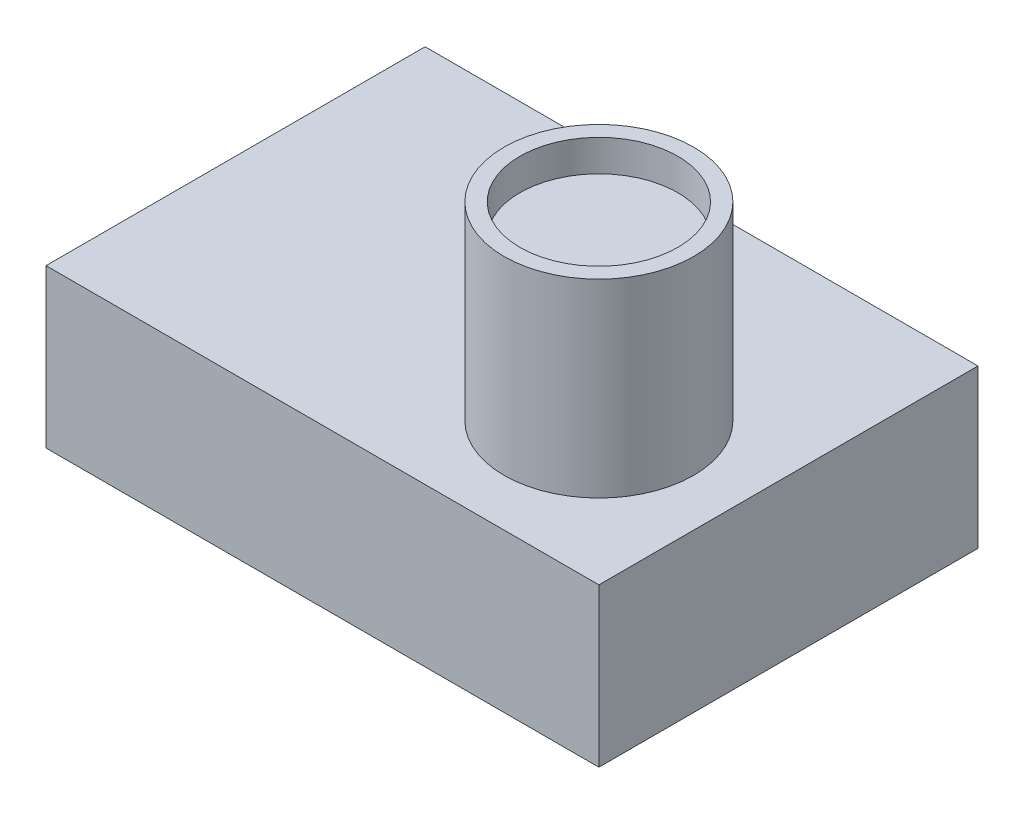
ISO-10303-21;
HEADER;
FILE_DESCRIPTION(('STEP AP214'),'2;1');
FILE_NAME('part.step','',(''),(''),'','','');
FILE_SCHEMA(('AUTOMOTIVE_DESIGN { 1 0 10303 214 1 1 1 1 }'));
ENDSEC;
DATA;
#1=APPLICATION_CONTEXT('core data for automotive mechanical design processes');
#2=APPLICATION_PROTOCOL_DEFINITION('international standard','automotive_design',2000,#1);
#3=PRODUCT_CONTEXT('',#1,'mechanical');
#4=PRODUCT('Part','Part','',(#3));
#5=PRODUCT_RELATED_PRODUCT_CATEGORY('part','',(#4));
#6=PRODUCT_DEFINITION_FORMATION('','',#4);
#7=PRODUCT_DEFINITION_CONTEXT('part definition',#1,'design');
#8=PRODUCT_DEFINITION('design','',#6,#7);
#9=PRODUCT_DEFINITION_SHAPE('','',#8);
#10=(LENGTH_UNIT() NAMED_UNIT(*) SI_UNIT(.MILLI.,.METRE.));
#11=(NAMED_UNIT(*) PLANE_ANGLE_UNIT() SI_UNIT($,.RADIAN.));
#12=(NAMED_UNIT(*) SI_UNIT($,.STERADIAN.) SOLID_ANGLE_UNIT());
#13=UNCERTAINTY_MEASURE_WITH_UNIT(LENGTH_MEASURE(1.E-05),#10,'distance_accuracy_value','');
#14=(GEOMETRIC_REPRESENTATION_CONTEXT(3) GLOBAL_UNCERTAINTY_ASSIGNED_CONTEXT((#13)) GLOBAL_UNIT_ASSIGNED_CONTEXT((#10,
#11,#12)) REPRESENTATION_CONTEXT('',''));
#15=CARTESIAN_POINT('',(0.,0.,0.));
#16=DIRECTION('',(0.,0.,1.));
#17=DIRECTION('',(1.,0.,0.));
#18=AXIS2_PLACEMENT_3D('',#15,#16,#17);
#19=CARTESIAN_POINT('',(17.5,10.,-12.));
#20=DIRECTION('',(-1.,0.,0.));
#21=DIRECTION('',(0.,0.,1.));
#22=AXIS2_PLACEMENT_3D('',#19,#20,#21);
#23=PLANE('',#22);
#24=DIRECTION('',(0.,0.,-1.));
#25=VECTOR('',#24,1.);
#26=CARTESIAN_POINT('',(17.5,0.,-12.));
#27=LINE('',#26,#25);
#28=CARTESIAN_POINT('',(17.5,0.,12.));
#29=VERTEX_POINT('',#28);
#30=CARTESIAN_POINT('',(17.5,0.,-12.));
#31=VERTEX_POINT('',#30);
#32=EDGE_CURVE('E112',#29,#31,#27,.T.);
#33=ORIENTED_EDGE('',*,*,#32,.T.);
#34=DIRECTION('',(0.,-1.,0.));
#35=VECTOR('',#34,1.);
#36=CARTESIAN_POINT('',(17.5,10.,-12.));
#37=LINE('',#36,#35);
#38=CARTESIAN_POINT('',(17.5,10.,-12.));
#39=VERTEX_POINT('',#38);
#40=EDGE_CURVE('E11',#39,#31,#37,.T.);
#41=ORIENTED_EDGE('',*,*,#40,.F.);
#42=DIRECTION('',(0.,0.,-1.));
#43=VECTOR('',#42,1.);
#44=CARTESIAN_POINT('',(17.5,10.,-12.));
#45=LINE('',#44,#43);
#46=CARTESIAN_POINT('',(17.5,10.,12.));
#47=VERTEX_POINT('',#46);
#48=EDGE_CURVE('E100',#47,#39,#45,.T.);
#49=ORIENTED_EDGE('',*,*,#48,.F.);
#50=DIRECTION('',(0.,-1.,0.));
#51=VECTOR('',#50,1.);
#52=CARTESIAN_POINT('',(17.5,10.,12.));
#53=LINE('',#52,#51);
#54=EDGE_CURVE('E108',#47,#29,#53,.T.);
#55=ORIENTED_EDGE('',*,*,#54,.T.);
#56=EDGE_LOOP('',(#33,#41,#49,#55));
#57=FACE_BOUND('',#56,.T.);
#58=ADVANCED_FACE('F49',(#57),#23,.F.);
#59=CARTESIAN_POINT('',(-17.5,10.,-12.));
#60=DIRECTION('',(0.,0.,1.));
#61=DIRECTION('',(1.,0.,0.));
#62=AXIS2_PLACEMENT_3D('',#59,#60,#61);
#63=PLANE('',#62);
#64=DIRECTION('',(-1.,0.,0.));
#65=VECTOR('',#64,1.);
#66=CARTESIAN_POINT('',(-17.5,0.,-12.));
#67=LINE('',#66,#65);
#68=CARTESIAN_POINT('',(-17.5,0.,-12.));
#69=VERTEX_POINT('',#68);
#70=EDGE_CURVE('E104',#31,#69,#67,.T.);
#71=ORIENTED_EDGE('',*,*,#70,.T.);
#72=DIRECTION('',(0.,-1.,0.));
#73=VECTOR('',#72,1.);
#74=CARTESIAN_POINT('',(-17.5,10.,-12.));
#75=LINE('',#74,#73);
#76=CARTESIAN_POINT('',(-17.5,10.,-12.));
#77=VERTEX_POINT('',#76);
#78=EDGE_CURVE('E57',#77,#69,#75,.T.);
#79=ORIENTED_EDGE('',*,*,#78,.F.);
#80=DIRECTION('',(-1.,0.,0.));
#81=VECTOR('',#80,1.);
#82=CARTESIAN_POINT('',(-17.5,10.,-12.));
#83=LINE('',#82,#81);
#84=EDGE_CURVE('E95',#39,#77,#83,.T.);
#85=ORIENTED_EDGE('',*,*,#84,.F.);
#86=ORIENTED_EDGE('',*,*,#40,.T.);
#87=EDGE_LOOP('',(#71,#79,#85,#86));
#88=FACE_BOUND('',#87,.T.);
#89=ADVANCED_FACE('F103',(#88),#63,.F.);
#90=CARTESIAN_POINT('',(-17.5,10.,-12.));
#91=DIRECTION('',(1.,0.,0.));
#92=DIRECTION('',(0.,0.,-1.));
#93=AXIS2_PLACEMENT_3D('',#90,#91,#92);
#94=PLANE('',#93);
#95=DIRECTION('',(0.,0.,1.));
#96=VECTOR('',#95,1.);
#97=CARTESIAN_POINT('',(-17.5,0.,-12.));
#98=LINE('',#97,#96);
#99=CARTESIAN_POINT('',(-17.5,0.,12.));
#100=VERTEX_POINT('',#99);
#101=EDGE_CURVE('E82',#69,#100,#98,.T.);
#102=ORIENTED_EDGE('',*,*,#101,.T.);
#103=DIRECTION('',(0.,-1.,0.));
#104=VECTOR('',#103,1.);
#105=CARTESIAN_POINT('',(-17.5,10.,12.));
#106=LINE('',#105,#104);
#107=CARTESIAN_POINT('',(-17.5,10.,12.));
#108=VERTEX_POINT('',#107);
#109=EDGE_CURVE('E105',#108,#100,#106,.T.);
#110=ORIENTED_EDGE('',*,*,#109,.F.);
#111=DIRECTION('',(0.,0.,1.));
#112=VECTOR('',#111,1.);
#113=CARTESIAN_POINT('',(-17.5,10.,-12.));
#114=LINE('',#113,#112);
#115=EDGE_CURVE('E98',#77,#108,#114,.T.);
#116=ORIENTED_EDGE('',*,*,#115,.F.);
#117=ORIENTED_EDGE('',*,*,#78,.T.);
#118=EDGE_LOOP('',(#102,#110,#116,#117));
#119=FACE_BOUND('',#118,.T.);
#120=ADVANCED_FACE('F106',(#119),#94,.F.);
#121=CARTESIAN_POINT('',(-17.5,10.,12.));
#122=DIRECTION('',(0.,0.,-1.));
#123=DIRECTION('',(-1.,0.,0.));
#124=AXIS2_PLACEMENT_3D('',#121,#122,#123);
#125=PLANE('',#124);
#126=DIRECTION('',(1.,0.,0.));
#127=VECTOR('',#126,1.);
#128=CARTESIAN_POINT('',(-17.5,0.,12.));
#129=LINE('',#128,#127);
#130=EDGE_CURVE('E88',#100,#29,#129,.T.);
#131=ORIENTED_EDGE('',*,*,#130,.T.);
#132=ORIENTED_EDGE('',*,*,#54,.F.);
#133=DIRECTION('',(1.,0.,0.));
#134=VECTOR('',#133,1.);
#135=CARTESIAN_POINT('',(-17.5,10.,12.));
#136=LINE('',#135,#134);
#137=EDGE_CURVE('E65',#108,#47,#136,.T.);
#138=ORIENTED_EDGE('',*,*,#137,.F.);
#139=ORIENTED_EDGE('',*,*,#109,.T.);
#140=EDGE_LOOP('',(#131,#132,#138,#139));
#141=FACE_BOUND('',#140,.T.);
#142=ADVANCED_FACE('F120',(#141),#125,.F.);
#143=CARTESIAN_POINT('',(0.,10.,0.));
#144=DIRECTION('',(0.,1.,0.));
#145=DIRECTION('',(0.,0.,1.));
#146=AXIS2_PLACEMENT_3D('',#143,#144,#145);
#147=PLANE('',#146);
#148=CARTESIAN_POINT('',(8.5,10.,3.));
#149=DIRECTION('',(0.,1.,0.));
#150=DIRECTION('',(0.,0.,1.));
#151=AXIS2_PLACEMENT_3D('',#148,#149,#150);
#152=CIRCLE('',#151,6.00000000000001);
#153=CARTESIAN_POINT('',(8.5,10.,9.00000000000001));
#154=VERTEX_POINT('',#153);
#155=EDGE_CURVE('E126',#154,#154,#152,.T.);
#156=ORIENTED_EDGE('',*,*,#155,.F.);
#157=EDGE_LOOP('',(#156));
#158=FACE_BOUND('',#157,.T.);
#159=ORIENTED_EDGE('',*,*,#48,.T.);
#160=ORIENTED_EDGE('',*,*,#84,.T.);
#161=ORIENTED_EDGE('',*,*,#115,.T.);
#162=ORIENTED_EDGE('',*,*,#137,.T.);
#163=EDGE_LOOP('',(#159,#160,#161,#162));
#164=FACE_BOUND('',#163,.T.);
#165=ADVANCED_FACE('F96',(#158,#164),#147,.T.);
#166=CARTESIAN_POINT('',(0.,0.,0.));
#167=DIRECTION('',(0.,1.,0.));
#168=DIRECTION('',(0.,0.,1.));
#169=AXIS2_PLACEMENT_3D('',#166,#167,#168);
#170=PLANE('',#169);
#171=ORIENTED_EDGE('',*,*,#32,.F.);
#172=ORIENTED_EDGE('',*,*,#130,.F.);
#173=ORIENTED_EDGE('',*,*,#101,.F.);
#174=ORIENTED_EDGE('',*,*,#70,.F.);
#175=EDGE_LOOP('',(#171,#172,#173,#174));
#176=FACE_BOUND('',#175,.T.);
#177=ADVANCED_FACE('F123',(#176),#170,.F.);
#178=CARTESIAN_POINT('',(8.5,22.,3.));
#179=DIRECTION('',(0.,-1.,0.));
#180=DIRECTION('',(0.,0.,-1.));
#181=AXIS2_PLACEMENT_3D('',#178,#179,#180);
#182=CYLINDRICAL_SURFACE('',#181,6.00000000000001);
#183=CARTESIAN_POINT('',(8.5,22.,3.));
#184=DIRECTION('',(0.,1.,0.));
#185=DIRECTION('',(0.,0.,1.));
#186=AXIS2_PLACEMENT_3D('',#183,#184,#185);
#187=CIRCLE('',#186,6.00000000000001);
#188=CARTESIAN_POINT('',(8.5,22.,9.00000000000001));
#189=VERTEX_POINT('',#188);
#190=EDGE_CURVE('E115',#189,#189,#187,.T.);
#191=ORIENTED_EDGE('',*,*,#190,.F.);
#192=EDGE_LOOP('',(#191));
#193=FACE_BOUND('',#192,.T.);
#194=ORIENTED_EDGE('',*,*,#155,.T.);
#195=EDGE_LOOP('',(#194));
#196=FACE_BOUND('',#195,.T.);
#197=ADVANCED_FACE('F149',(#193,#196),#182,.T.);
#198=CARTESIAN_POINT('',(8.5,22.,3.));
#199=DIRECTION('',(0.,1.,0.));
#200=DIRECTION('',(0.,0.,1.));
#201=AXIS2_PLACEMENT_3D('',#198,#199,#200);
#202=PLANE('',#201);
#203=CARTESIAN_POINT('',(8.5,22.,3.));
#204=DIRECTION('',(0.,1.,0.));
#205=DIRECTION('',(0.,0.,1.));
#206=AXIS2_PLACEMENT_3D('',#203,#204,#205);
#207=CIRCLE('',#206,5.);
#208=CARTESIAN_POINT('',(8.5,22.,8.));
#209=VERTEX_POINT('',#208);
#210=EDGE_CURVE('E132',#209,#209,#207,.T.);
#211=ORIENTED_EDGE('',*,*,#210,.F.);
#212=EDGE_LOOP('',(#211));
#213=FACE_BOUND('',#212,.T.);
#214=ORIENTED_EDGE('',*,*,#190,.T.);
#215=EDGE_LOOP('',(#214));
#216=FACE_BOUND('',#215,.T.);
#217=ADVANCED_FACE('F143',(#213,#216),#202,.T.);
#218=CARTESIAN_POINT('',(8.5,20.,3.));
#219=DIRECTION('',(0.,1.,0.));
#220=DIRECTION('',(0.,0.,1.));
#221=AXIS2_PLACEMENT_3D('',#218,#219,#220);
#222=CYLINDRICAL_SURFACE('',#221,5.);
#223=CARTESIAN_POINT('',(8.5,20.,3.));
#224=DIRECTION('',(0.,1.,0.));
#225=DIRECTION('',(0.,0.,1.));
#226=AXIS2_PLACEMENT_3D('',#223,#224,#225);
#227=CIRCLE('',#226,5.);
#228=CARTESIAN_POINT('',(8.5,20.,8.));
#229=VERTEX_POINT('',#228);
#230=EDGE_CURVE('E129',#229,#229,#227,.T.);
#231=ORIENTED_EDGE('',*,*,#230,.F.);
#232=EDGE_LOOP('',(#231));
#233=FACE_BOUND('',#232,.T.);
#234=ORIENTED_EDGE('',*,*,#210,.T.);
#235=EDGE_LOOP('',(#234));
#236=FACE_BOUND('',#235,.T.);
#237=ADVANCED_FACE('F140',(#233,#236),#222,.F.);
#238=CARTESIAN_POINT('',(8.5,20.,3.));
#239=DIRECTION('',(0.,1.,0.));
#240=DIRECTION('',(0.,0.,1.));
#241=AXIS2_PLACEMENT_3D('',#238,#239,#240);
#242=PLANE('',#241);
#243=ORIENTED_EDGE('',*,*,#230,.T.);
#244=EDGE_LOOP('',(#243));
#245=FACE_BOUND('',#244,.T.);
#246=ADVANCED_FACE('F138',(#245),#242,.T.);
#247=CLOSED_SHELL('',(#58,#89,#120,#142,#165,#177,#197,#217,#237,#246));
#248=MANIFOLD_SOLID_BREP('B2',#247);
#249=ADVANCED_BREP_SHAPE_REPRESENTATION('',(#18,#248),#14);
#250=SHAPE_DEFINITION_REPRESENTATION(#9,#249);
ENDSEC;
END-ISO-10303-21;
